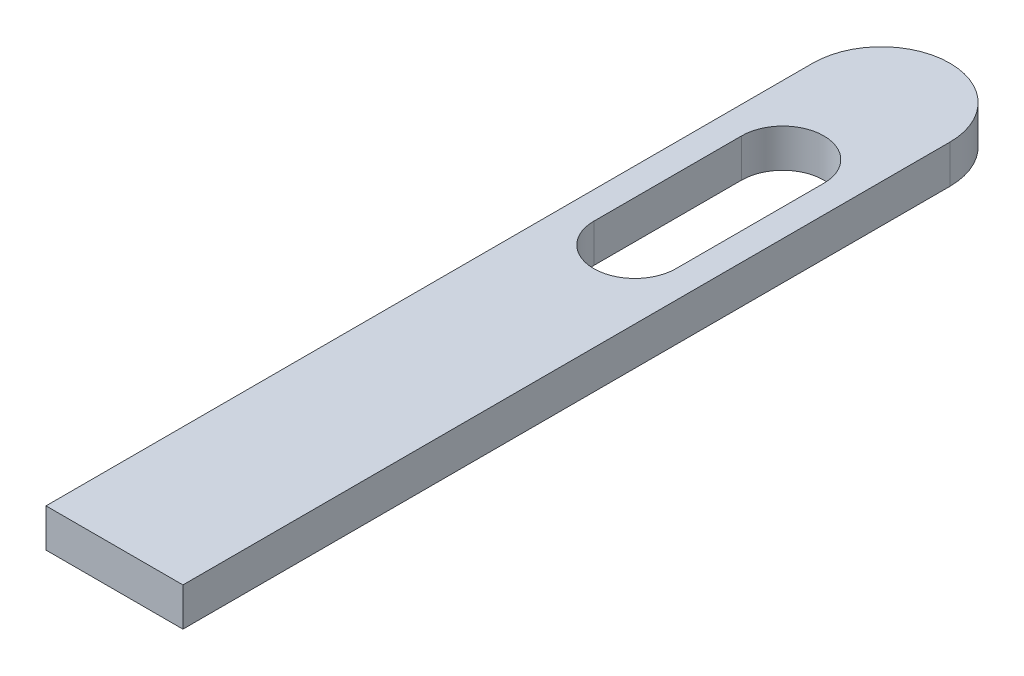
ISO-10303-21;
HEADER;
FILE_DESCRIPTION(('STEP AP214'),'2;1');
FILE_NAME('part.step','',(''),(''),'','','');
FILE_SCHEMA(('AUTOMOTIVE_DESIGN { 1 0 10303 214 1 1 1 1 }'));
ENDSEC;
DATA;
#1=APPLICATION_CONTEXT('core data for automotive mechanical design processes');
#2=APPLICATION_PROTOCOL_DEFINITION('international standard','automotive_design',2000,#1);
#3=PRODUCT_CONTEXT('',#1,'mechanical');
#4=PRODUCT('Part','Part','',(#3));
#5=PRODUCT_RELATED_PRODUCT_CATEGORY('part','',(#4));
#6=PRODUCT_DEFINITION_FORMATION('','',#4);
#7=PRODUCT_DEFINITION_CONTEXT('part definition',#1,'design');
#8=PRODUCT_DEFINITION('design','',#6,#7);
#9=PRODUCT_DEFINITION_SHAPE('','',#8);
#10=(LENGTH_UNIT() NAMED_UNIT(*) SI_UNIT(.MILLI.,.METRE.));
#11=(NAMED_UNIT(*) PLANE_ANGLE_UNIT() SI_UNIT($,.RADIAN.));
#12=(NAMED_UNIT(*) SI_UNIT($,.STERADIAN.) SOLID_ANGLE_UNIT());
#13=UNCERTAINTY_MEASURE_WITH_UNIT(LENGTH_MEASURE(1.E-05),#10,'distance_accuracy_value','');
#14=(GEOMETRIC_REPRESENTATION_CONTEXT(3) GLOBAL_UNCERTAINTY_ASSIGNED_CONTEXT((#13)) GLOBAL_UNIT_ASSIGNED_CONTEXT((#10,
#11,#12)) REPRESENTATION_CONTEXT('',''));
#15=CARTESIAN_POINT('',(0.,0.,0.));
#16=DIRECTION('',(0.,0.,1.));
#17=DIRECTION('',(1.,0.,0.));
#18=AXIS2_PLACEMENT_3D('',#15,#16,#17);
#19=CARTESIAN_POINT('',(0.,0.175,-3.5));
#20=DIRECTION('',(0.,-1.,0.));
#21=DIRECTION('',(0.,0.,-1.));
#22=AXIS2_PLACEMENT_3D('',#19,#20,#21);
#23=PLANE('',#22);
#24=DIRECTION('',(0.,0.,-1.));
#25=VECTOR('',#24,1.);
#26=CARTESIAN_POINT('',(0.625,0.175,-3.5));
#27=LINE('',#26,#25);
#28=CARTESIAN_POINT('',(0.625000000000001,0.175,3.5));
#29=VERTEX_POINT('',#28);
#30=CARTESIAN_POINT('',(0.625,0.175,-3.5));
#31=VERTEX_POINT('',#30);
#32=EDGE_CURVE('E134',#29,#31,#27,.T.);
#33=ORIENTED_EDGE('',*,*,#32,.T.);
#34=CARTESIAN_POINT('',(0.,0.175,-3.5));
#35=DIRECTION('',(0.,1.,0.));
#36=DIRECTION('',(0.,0.,-1.));
#37=AXIS2_PLACEMENT_3D('',#34,#35,#36);
#38=CIRCLE('',#37,0.625);
#39=CARTESIAN_POINT('',(-0.625,0.175,-3.5));
#40=VERTEX_POINT('',#39);
#41=EDGE_CURVE('E137',#31,#40,#38,.T.);
#42=ORIENTED_EDGE('',*,*,#41,.T.);
#43=DIRECTION('',(0.,0.,1.));
#44=VECTOR('',#43,1.);
#45=CARTESIAN_POINT('',(-0.625,0.175,-3.5));
#46=LINE('',#45,#44);
#47=CARTESIAN_POINT('',(-0.625000000000001,0.175,3.5));
#48=VERTEX_POINT('',#47);
#49=EDGE_CURVE('E140',#40,#48,#46,.T.);
#50=ORIENTED_EDGE('',*,*,#49,.T.);
#51=DIRECTION('',(1.,0.,0.));
#52=VECTOR('',#51,1.);
#53=CARTESIAN_POINT('',(-0.625000000000001,0.175,3.5));
#54=LINE('',#53,#52);
#55=EDGE_CURVE('E142',#48,#29,#54,.T.);
#56=ORIENTED_EDGE('',*,*,#55,.T.);
#57=EDGE_LOOP('',(#33,#42,#50,#56));
#58=FACE_BOUND('',#57,.T.);
#59=CARTESIAN_POINT('',(0.,0.175,-2.6));
#60=DIRECTION('',(0.,1.,0.));
#61=DIRECTION('',(0.,0.,1.));
#62=AXIS2_PLACEMENT_3D('',#59,#60,#61);
#63=CIRCLE('',#62,0.375);
#64=CARTESIAN_POINT('',(0.375,0.175,-2.6));
#65=VERTEX_POINT('',#64);
#66=CARTESIAN_POINT('',(-0.375,0.175,-2.6));
#67=VERTEX_POINT('',#66);
#68=EDGE_CURVE('E98',#65,#67,#63,.T.);
#69=ORIENTED_EDGE('',*,*,#68,.F.);
#70=DIRECTION('',(0.,0.,-1.));
#71=VECTOR('',#70,1.);
#72=CARTESIAN_POINT('',(0.375,0.175,-2.6));
#73=LINE('',#72,#71);
#74=CARTESIAN_POINT('',(0.375,0.175,-1.25));
#75=VERTEX_POINT('',#74);
#76=EDGE_CURVE('E120',#75,#65,#73,.T.);
#77=ORIENTED_EDGE('',*,*,#76,.F.);
#78=CARTESIAN_POINT('',(0.,0.175,-1.25));
#79=DIRECTION('',(0.,1.,0.));
#80=DIRECTION('',(0.,0.,1.));
#81=AXIS2_PLACEMENT_3D('',#78,#79,#80);
#82=CIRCLE('',#81,0.375);
#83=CARTESIAN_POINT('',(-0.375,0.175,-1.25));
#84=VERTEX_POINT('',#83);
#85=EDGE_CURVE('E118',#84,#75,#82,.T.);
#86=ORIENTED_EDGE('',*,*,#85,.F.);
#87=DIRECTION('',(0.,0.,1.));
#88=VECTOR('',#87,1.);
#89=CARTESIAN_POINT('',(-0.375,0.175,-2.6));
#90=LINE('',#89,#88);
#91=EDGE_CURVE('E106',#67,#84,#90,.T.);
#92=ORIENTED_EDGE('',*,*,#91,.F.);
#93=EDGE_LOOP('',(#69,#77,#86,#92));
#94=FACE_BOUND('',#93,.T.);
#95=ADVANCED_FACE('F33',(#58,#94),#23,.F.);
#96=CARTESIAN_POINT('',(0.,-0.175,-3.5));
#97=DIRECTION('',(0.,-1.,0.));
#98=DIRECTION('',(0.,0.,-1.));
#99=AXIS2_PLACEMENT_3D('',#96,#97,#98);
#100=PLANE('',#99);
#101=DIRECTION('',(0.,0.,-1.));
#102=VECTOR('',#101,1.);
#103=CARTESIAN_POINT('',(0.625,-0.175,-3.5));
#104=LINE('',#103,#102);
#105=CARTESIAN_POINT('',(0.625000000000001,-0.175,3.5));
#106=VERTEX_POINT('',#105);
#107=CARTESIAN_POINT('',(0.625,-0.175,-3.5));
#108=VERTEX_POINT('',#107);
#109=EDGE_CURVE('E114',#106,#108,#104,.T.);
#110=ORIENTED_EDGE('',*,*,#109,.F.);
#111=DIRECTION('',(1.,0.,0.));
#112=VECTOR('',#111,1.);
#113=CARTESIAN_POINT('',(-0.625000000000001,-0.175,3.5));
#114=LINE('',#113,#112);
#115=CARTESIAN_POINT('',(-0.625000000000001,-0.175,3.5));
#116=VERTEX_POINT('',#115);
#117=EDGE_CURVE('E138',#116,#106,#114,.T.);
#118=ORIENTED_EDGE('',*,*,#117,.F.);
#119=DIRECTION('',(0.,0.,1.));
#120=VECTOR('',#119,1.);
#121=CARTESIAN_POINT('',(-0.625,-0.175,-3.5));
#122=LINE('',#121,#120);
#123=CARTESIAN_POINT('',(-0.625,-0.175,-3.5));
#124=VERTEX_POINT('',#123);
#125=EDGE_CURVE('E149',#124,#116,#122,.T.);
#126=ORIENTED_EDGE('',*,*,#125,.F.);
#127=CARTESIAN_POINT('',(0.,-0.175,-3.5));
#128=DIRECTION('',(0.,1.,0.));
#129=DIRECTION('',(0.,0.,-1.));
#130=AXIS2_PLACEMENT_3D('',#127,#128,#129);
#131=CIRCLE('',#130,0.625);
#132=EDGE_CURVE('E147',#108,#124,#131,.T.);
#133=ORIENTED_EDGE('',*,*,#132,.F.);
#134=EDGE_LOOP('',(#110,#118,#126,#133));
#135=FACE_BOUND('',#134,.T.);
#136=DIRECTION('',(0.,0.,-1.));
#137=VECTOR('',#136,1.);
#138=CARTESIAN_POINT('',(0.375,-0.175,-2.6));
#139=LINE('',#138,#137);
#140=CARTESIAN_POINT('',(0.375,-0.175,-1.25));
#141=VERTEX_POINT('',#140);
#142=CARTESIAN_POINT('',(0.375,-0.175,-2.6));
#143=VERTEX_POINT('',#142);
#144=EDGE_CURVE('E107',#141,#143,#139,.T.);
#145=ORIENTED_EDGE('',*,*,#144,.T.);
#146=CARTESIAN_POINT('',(0.,-0.175,-2.6));
#147=DIRECTION('',(0.,1.,0.));
#148=DIRECTION('',(0.,0.,1.));
#149=AXIS2_PLACEMENT_3D('',#146,#147,#148);
#150=CIRCLE('',#149,0.375);
#151=CARTESIAN_POINT('',(-0.375,-0.175,-2.6));
#152=VERTEX_POINT('',#151);
#153=EDGE_CURVE('E56',#143,#152,#150,.T.);
#154=ORIENTED_EDGE('',*,*,#153,.T.);
#155=DIRECTION('',(0.,0.,1.));
#156=VECTOR('',#155,1.);
#157=CARTESIAN_POINT('',(-0.375,-0.175,-2.6));
#158=LINE('',#157,#156);
#159=CARTESIAN_POINT('',(-0.375,-0.175,-1.25));
#160=VERTEX_POINT('',#159);
#161=EDGE_CURVE('E113',#152,#160,#158,.T.);
#162=ORIENTED_EDGE('',*,*,#161,.T.);
#163=CARTESIAN_POINT('',(0.,-0.175,-1.25));
#164=DIRECTION('',(0.,1.,0.));
#165=DIRECTION('',(0.,0.,1.));
#166=AXIS2_PLACEMENT_3D('',#163,#164,#165);
#167=CIRCLE('',#166,0.375);
#168=EDGE_CURVE('E126',#160,#141,#167,.T.);
#169=ORIENTED_EDGE('',*,*,#168,.T.);
#170=EDGE_LOOP('',(#145,#154,#162,#169));
#171=FACE_BOUND('',#170,.T.);
#172=ADVANCED_FACE('F167',(#135,#171),#100,.T.);
#173=CARTESIAN_POINT('',(0.625,0.175,-3.5));
#174=DIRECTION('',(-1.,0.,0.));
#175=DIRECTION('',(0.,0.,1.));
#176=AXIS2_PLACEMENT_3D('',#173,#174,#175);
#177=PLANE('',#176);
#178=ORIENTED_EDGE('',*,*,#109,.T.);
#179=DIRECTION('',(0.,-1.,0.));
#180=VECTOR('',#179,1.);
#181=CARTESIAN_POINT('',(0.625,0.175,-3.5));
#182=LINE('',#181,#180);
#183=EDGE_CURVE('E11',#31,#108,#182,.T.);
#184=ORIENTED_EDGE('',*,*,#183,.F.);
#185=ORIENTED_EDGE('',*,*,#32,.F.);
#186=DIRECTION('',(0.,-1.,0.));
#187=VECTOR('',#186,1.);
#188=CARTESIAN_POINT('',(0.625000000000001,0.175,3.5));
#189=LINE('',#188,#187);
#190=EDGE_CURVE('E144',#29,#106,#189,.T.);
#191=ORIENTED_EDGE('',*,*,#190,.T.);
#192=EDGE_LOOP('',(#178,#184,#185,#191));
#193=FACE_BOUND('',#192,.T.);
#194=ADVANCED_FACE('F35',(#193),#177,.F.);
#195=CARTESIAN_POINT('',(0.,0.175,-3.5));
#196=DIRECTION('',(0.,-1.,0.));
#197=DIRECTION('',(0.,0.,-1.));
#198=AXIS2_PLACEMENT_3D('',#195,#196,#197);
#199=CYLINDRICAL_SURFACE('',#198,0.625);
#200=ORIENTED_EDGE('',*,*,#132,.T.);
#201=DIRECTION('',(0.,-1.,0.));
#202=VECTOR('',#201,1.);
#203=CARTESIAN_POINT('',(-0.625,0.175,-3.5));
#204=LINE('',#203,#202);
#205=EDGE_CURVE('E41',#40,#124,#204,.T.);
#206=ORIENTED_EDGE('',*,*,#205,.F.);
#207=ORIENTED_EDGE('',*,*,#41,.F.);
#208=ORIENTED_EDGE('',*,*,#183,.T.);
#209=EDGE_LOOP('',(#200,#206,#207,#208));
#210=FACE_BOUND('',#209,.T.);
#211=ADVANCED_FACE('F177',(#210),#199,.T.);
#212=CARTESIAN_POINT('',(-0.625,0.175,-3.5));
#213=DIRECTION('',(1.,0.,0.));
#214=DIRECTION('',(0.,0.,-1.));
#215=AXIS2_PLACEMENT_3D('',#212,#213,#214);
#216=PLANE('',#215);
#217=ORIENTED_EDGE('',*,*,#125,.T.);
#218=DIRECTION('',(0.,-1.,0.));
#219=VECTOR('',#218,1.);
#220=CARTESIAN_POINT('',(-0.625000000000001,0.175,3.5));
#221=LINE('',#220,#219);
#222=EDGE_CURVE('E154',#48,#116,#221,.T.);
#223=ORIENTED_EDGE('',*,*,#222,.F.);
#224=ORIENTED_EDGE('',*,*,#49,.F.);
#225=ORIENTED_EDGE('',*,*,#205,.T.);
#226=EDGE_LOOP('',(#217,#223,#224,#225));
#227=FACE_BOUND('',#226,.T.);
#228=ADVANCED_FACE('F161',(#227),#216,.F.);
#229=CARTESIAN_POINT('',(-0.625000000000001,0.175,3.5));
#230=DIRECTION('',(0.,0.,-1.));
#231=DIRECTION('',(-1.,0.,0.));
#232=AXIS2_PLACEMENT_3D('',#229,#230,#231);
#233=PLANE('',#232);
#234=ORIENTED_EDGE('',*,*,#117,.T.);
#235=ORIENTED_EDGE('',*,*,#190,.F.);
#236=ORIENTED_EDGE('',*,*,#55,.F.);
#237=ORIENTED_EDGE('',*,*,#222,.T.);
#238=EDGE_LOOP('',(#234,#235,#236,#237));
#239=FACE_BOUND('',#238,.T.);
#240=ADVANCED_FACE('F171',(#239),#233,.F.);
#241=CARTESIAN_POINT('',(0.,0.175,-2.6));
#242=DIRECTION('',(0.,-1.,0.));
#243=DIRECTION('',(0.,0.,-1.));
#244=AXIS2_PLACEMENT_3D('',#241,#242,#243);
#245=CYLINDRICAL_SURFACE('',#244,0.375);
#246=ORIENTED_EDGE('',*,*,#153,.F.);
#247=DIRECTION('',(0.,-1.,0.));
#248=VECTOR('',#247,1.);
#249=CARTESIAN_POINT('',(0.375,0.175,-2.6));
#250=LINE('',#249,#248);
#251=EDGE_CURVE('E102',#65,#143,#250,.T.);
#252=ORIENTED_EDGE('',*,*,#251,.F.);
#253=ORIENTED_EDGE('',*,*,#68,.T.);
#254=DIRECTION('',(0.,-1.,0.));
#255=VECTOR('',#254,1.);
#256=CARTESIAN_POINT('',(-0.375,0.175,-2.6));
#257=LINE('',#256,#255);
#258=EDGE_CURVE('E101',#67,#152,#257,.T.);
#259=ORIENTED_EDGE('',*,*,#258,.T.);
#260=EDGE_LOOP('',(#246,#252,#253,#259));
#261=FACE_BOUND('',#260,.T.);
#262=ADVANCED_FACE('F100',(#261),#245,.F.);
#263=CARTESIAN_POINT('',(-0.375,0.175,-2.6));
#264=DIRECTION('',(1.,0.,0.));
#265=DIRECTION('',(0.,0.,-1.));
#266=AXIS2_PLACEMENT_3D('',#263,#264,#265);
#267=PLANE('',#266);
#268=ORIENTED_EDGE('',*,*,#161,.F.);
#269=ORIENTED_EDGE('',*,*,#258,.F.);
#270=ORIENTED_EDGE('',*,*,#91,.T.);
#271=DIRECTION('',(0.,-1.,0.));
#272=VECTOR('',#271,1.);
#273=CARTESIAN_POINT('',(-0.375,0.175,-1.25));
#274=LINE('',#273,#272);
#275=EDGE_CURVE('E115',#84,#160,#274,.T.);
#276=ORIENTED_EDGE('',*,*,#275,.T.);
#277=EDGE_LOOP('',(#268,#269,#270,#276));
#278=FACE_BOUND('',#277,.T.);
#279=ADVANCED_FACE('F110',(#278),#267,.T.);
#280=CARTESIAN_POINT('',(0.,0.175,-1.25));
#281=DIRECTION('',(0.,-1.,0.));
#282=DIRECTION('',(0.,0.,-1.));
#283=AXIS2_PLACEMENT_3D('',#280,#281,#282);
#284=CYLINDRICAL_SURFACE('',#283,0.375);
#285=ORIENTED_EDGE('',*,*,#168,.F.);
#286=ORIENTED_EDGE('',*,*,#275,.F.);
#287=ORIENTED_EDGE('',*,*,#85,.T.);
#288=DIRECTION('',(0.,-1.,0.));
#289=VECTOR('',#288,1.);
#290=CARTESIAN_POINT('',(0.375,0.175,-1.25));
#291=LINE('',#290,#289);
#292=EDGE_CURVE('E48',#75,#141,#291,.T.);
#293=ORIENTED_EDGE('',*,*,#292,.T.);
#294=EDGE_LOOP('',(#285,#286,#287,#293));
#295=FACE_BOUND('',#294,.T.);
#296=ADVANCED_FACE('F200',(#295),#284,.F.);
#297=CARTESIAN_POINT('',(0.375,0.175,-2.6));
#298=DIRECTION('',(-1.,0.,0.));
#299=DIRECTION('',(0.,0.,1.));
#300=AXIS2_PLACEMENT_3D('',#297,#298,#299);
#301=PLANE('',#300);
#302=ORIENTED_EDGE('',*,*,#144,.F.);
#303=ORIENTED_EDGE('',*,*,#292,.F.);
#304=ORIENTED_EDGE('',*,*,#76,.T.);
#305=ORIENTED_EDGE('',*,*,#251,.T.);
#306=EDGE_LOOP('',(#302,#303,#304,#305));
#307=FACE_BOUND('',#306,.T.);
#308=ADVANCED_FACE('F204',(#307),#301,.T.);
#309=CLOSED_SHELL('',(#95,#172,#194,#211,#228,#240,#262,#279,#296,#308));
#310=MANIFOLD_SOLID_BREP('B2',#309);
#311=ADVANCED_BREP_SHAPE_REPRESENTATION('',(#18,#310),#14);
#312=SHAPE_DEFINITION_REPRESENTATION(#9,#311);
ENDSEC;
END-ISO-10303-21;
